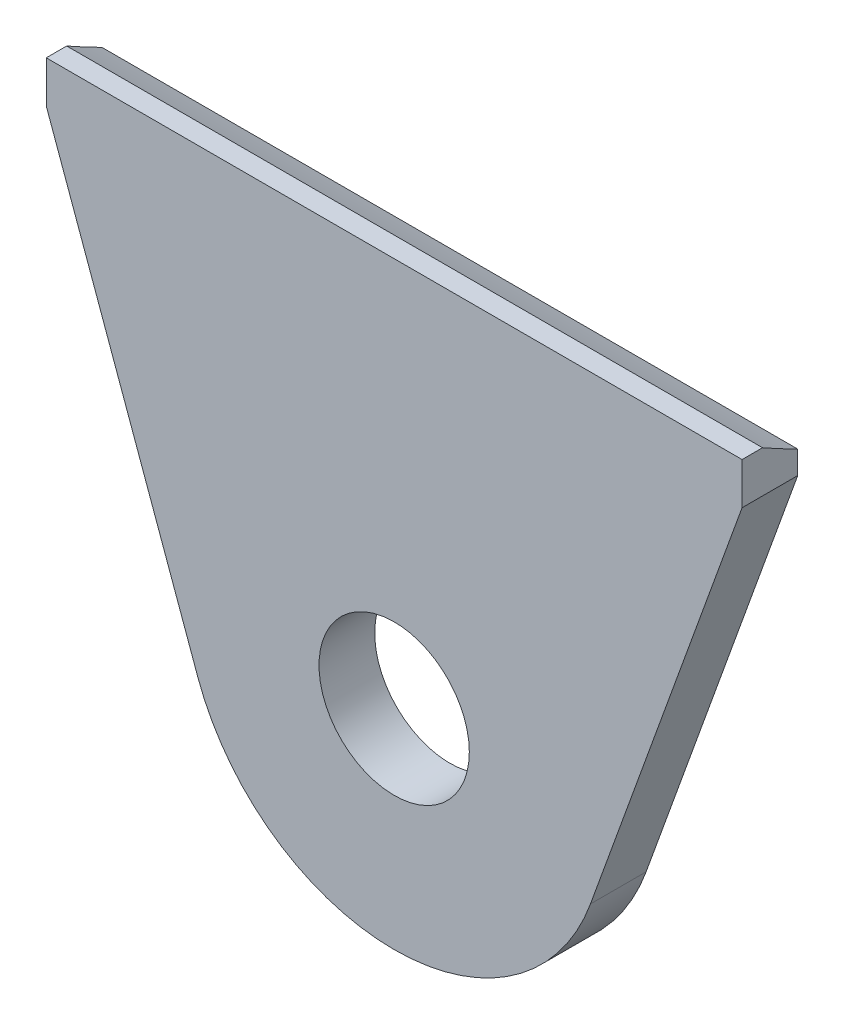
ISO-10303-21;
HEADER;
FILE_DESCRIPTION(('STEP AP214'),'2;1');
FILE_NAME('part.step','',(''),(''),'','','');
FILE_SCHEMA(('AUTOMOTIVE_DESIGN { 1 0 10303 214 1 1 1 1 }'));
ENDSEC;
DATA;
#1=APPLICATION_CONTEXT('core data for automotive mechanical design processes');
#2=APPLICATION_PROTOCOL_DEFINITION('international standard','automotive_design',2000,#1);
#3=PRODUCT_CONTEXT('',#1,'mechanical');
#4=PRODUCT('Part','Part','',(#3));
#5=PRODUCT_RELATED_PRODUCT_CATEGORY('part','',(#4));
#6=PRODUCT_DEFINITION_FORMATION('','',#4);
#7=PRODUCT_DEFINITION_CONTEXT('part definition',#1,'design');
#8=PRODUCT_DEFINITION('design','',#6,#7);
#9=PRODUCT_DEFINITION_SHAPE('','',#8);
#10=(LENGTH_UNIT() NAMED_UNIT(*) SI_UNIT(.MILLI.,.METRE.));
#11=(NAMED_UNIT(*) PLANE_ANGLE_UNIT() SI_UNIT($,.RADIAN.));
#12=(NAMED_UNIT(*) SI_UNIT($,.STERADIAN.) SOLID_ANGLE_UNIT());
#13=UNCERTAINTY_MEASURE_WITH_UNIT(LENGTH_MEASURE(1.E-05),#10,'distance_accuracy_value','');
#14=(GEOMETRIC_REPRESENTATION_CONTEXT(3) GLOBAL_UNCERTAINTY_ASSIGNED_CONTEXT((#13)) GLOBAL_UNIT_ASSIGNED_CONTEXT((#10,
#11,#12)) REPRESENTATION_CONTEXT('',''));
#15=CARTESIAN_POINT('',(0.,0.,0.));
#16=DIRECTION('',(0.,0.,1.));
#17=DIRECTION('',(1.,0.,0.));
#18=AXIS2_PLACEMENT_3D('',#15,#16,#17);
#19=CARTESIAN_POINT('',(25.,28.,4.));
#20=DIRECTION('',(-1.,0.,0.));
#21=DIRECTION('',(0.,0.,1.));
#22=AXIS2_PLACEMENT_3D('',#19,#20,#21);
#23=PLANE('',#22);
#24=CARTESIAN_POINT('',(25.,86.,-30.));
#25=DIRECTION('',(1.,0.,0.));
#26=DIRECTION('',(0.,0.,-1.));
#27=AXIS2_PLACEMENT_3D('',#24,#25,#26);
#28=CIRCLE('',#27,66.5);
#29=CARTESIAN_POINT('',(25.,28.,2.53075467922627));
#30=VERTEX_POINT('',#29);
#31=CARTESIAN_POINT('',(25.,26.6514532612634,0.));
#32=VERTEX_POINT('',#31);
#33=EDGE_CURVE('E121',#30,#32,#28,.T.);
#34=ORIENTED_EDGE('',*,*,#33,.F.);
#35=DIRECTION('',(0.,0.,-1.));
#36=VECTOR('',#35,1.);
#37=CARTESIAN_POINT('',(25.,28.,4.));
#38=LINE('',#37,#36);
#39=CARTESIAN_POINT('',(25.,28.,4.));
#40=VERTEX_POINT('',#39);
#41=EDGE_CURVE('E120',#40,#30,#38,.T.);
#42=ORIENTED_EDGE('',*,*,#41,.F.);
#43=DIRECTION('',(0.,1.,0.));
#44=VECTOR('',#43,1.);
#45=CARTESIAN_POINT('',(25.,28.,4.));
#46=LINE('',#45,#44);
#47=CARTESIAN_POINT('',(25.,25.,4.));
#48=VERTEX_POINT('',#47);
#49=EDGE_CURVE('E105',#48,#40,#46,.T.);
#50=ORIENTED_EDGE('',*,*,#49,.F.);
#51=DIRECTION('',(0.,0.,-1.));
#52=VECTOR('',#51,1.);
#53=CARTESIAN_POINT('',(25.,25.,4.));
#54=LINE('',#53,#52);
#55=CARTESIAN_POINT('',(25.,25.,0.));
#56=VERTEX_POINT('',#55);
#57=EDGE_CURVE('E123',#48,#56,#54,.T.);
#58=ORIENTED_EDGE('',*,*,#57,.T.);
#59=DIRECTION('',(0.,1.,0.));
#60=VECTOR('',#59,1.);
#61=CARTESIAN_POINT('',(25.,28.,0.));
#62=LINE('',#61,#60);
#63=EDGE_CURVE('E141',#56,#32,#62,.T.);
#64=ORIENTED_EDGE('',*,*,#63,.T.);
#65=EDGE_LOOP('',(#34,#42,#50,#58,#64));
#66=FACE_BOUND('',#65,.T.);
#67=ADVANCED_FACE('F41',(#66),#23,.F.);
#68=CARTESIAN_POINT('',(0.,0.,4.));
#69=DIRECTION('',(0.,0.,1.));
#70=DIRECTION('',(1.,0.,0.));
#71=AXIS2_PLACEMENT_3D('',#68,#69,#70);
#72=PLANE('',#71);
#73=DIRECTION('',(0.340312423743285,-0.940312423743285,0.));
#74=VECTOR('',#73,1.);
#75=CARTESIAN_POINT('',(-25.,25.,4.));
#76=LINE('',#75,#74);
#77=CARTESIAN_POINT('',(-25.,25.,4.));
#78=VERTEX_POINT('',#77);
#79=CARTESIAN_POINT('',(-14.1046863561493,-5.10468635614927,4.));
#80=VERTEX_POINT('',#79);
#81=EDGE_CURVE('E143',#78,#80,#76,.T.);
#82=ORIENTED_EDGE('',*,*,#81,.T.);
#83=CARTESIAN_POINT('',(0.,0.,4.));
#84=DIRECTION('',(0.,0.,1.));
#85=DIRECTION('',(1.,0.,0.));
#86=AXIS2_PLACEMENT_3D('',#83,#84,#85);
#87=CIRCLE('',#86,15.);
#88=CARTESIAN_POINT('',(14.1046863561493,-5.10468635614927,4.));
#89=VERTEX_POINT('',#88);
#90=EDGE_CURVE('E92',#80,#89,#87,.T.);
#91=ORIENTED_EDGE('',*,*,#90,.T.);
#92=DIRECTION('',(0.340312423743285,0.940312423743285,0.));
#93=VECTOR('',#92,1.);
#94=CARTESIAN_POINT('',(25.,25.,4.));
#95=LINE('',#94,#93);
#96=EDGE_CURVE('E109',#89,#48,#95,.T.);
#97=ORIENTED_EDGE('',*,*,#96,.T.);
#98=ORIENTED_EDGE('',*,*,#49,.T.);
#99=DIRECTION('',(-1.,0.,0.));
#100=VECTOR('',#99,1.);
#101=CARTESIAN_POINT('',(-25.,28.,4.));
#102=LINE('',#101,#100);
#103=CARTESIAN_POINT('',(-25.,28.,4.));
#104=VERTEX_POINT('',#103);
#105=EDGE_CURVE('E107',#40,#104,#102,.T.);
#106=ORIENTED_EDGE('',*,*,#105,.T.);
#107=DIRECTION('',(0.,-1.,0.));
#108=VECTOR('',#107,1.);
#109=CARTESIAN_POINT('',(-25.,28.,4.));
#110=LINE('',#109,#108);
#111=EDGE_CURVE('E63',#104,#78,#110,.T.);
#112=ORIENTED_EDGE('',*,*,#111,.T.);
#113=EDGE_LOOP('',(#82,#91,#97,#98,#106,#112));
#114=FACE_BOUND('',#113,.T.);
#115=CARTESIAN_POINT('',(0.,0.,4.));
#116=DIRECTION('',(0.,0.,1.));
#117=DIRECTION('',(1.,0.,0.));
#118=AXIS2_PLACEMENT_3D('',#115,#116,#117);
#119=CIRCLE('',#118,5.4);
#120=CARTESIAN_POINT('',(5.4,0.,4.));
#121=VERTEX_POINT('',#120);
#122=EDGE_CURVE('E140',#121,#121,#119,.T.);
#123=ORIENTED_EDGE('',*,*,#122,.F.);
#124=EDGE_LOOP('',(#123));
#125=FACE_BOUND('',#124,.T.);
#126=ADVANCED_FACE('F104',(#114,#125),#72,.T.);
#127=CARTESIAN_POINT('',(0.,0.,0.));
#128=DIRECTION('',(0.,0.,1.));
#129=DIRECTION('',(1.,0.,0.));
#130=AXIS2_PLACEMENT_3D('',#127,#128,#129);
#131=PLANE('',#130);
#132=DIRECTION('',(0.,-1.,0.));
#133=VECTOR('',#132,1.);
#134=CARTESIAN_POINT('',(-25.,28.,0.));
#135=LINE('',#134,#133);
#136=CARTESIAN_POINT('',(-25.,26.6514532612634,0.));
#137=VERTEX_POINT('',#136);
#138=CARTESIAN_POINT('',(-25.,25.,0.));
#139=VERTEX_POINT('',#138);
#140=EDGE_CURVE('E83',#137,#139,#135,.T.);
#141=ORIENTED_EDGE('',*,*,#140,.F.);
#142=DIRECTION('',(1.,0.,0.));
#143=VECTOR('',#142,1.);
#144=CARTESIAN_POINT('',(-25.,26.6514532612634,0.));
#145=LINE('',#144,#143);
#146=EDGE_CURVE('E160',#137,#32,#145,.T.);
#147=ORIENTED_EDGE('',*,*,#146,.T.);
#148=ORIENTED_EDGE('',*,*,#63,.F.);
#149=DIRECTION('',(0.340312423743285,0.940312423743285,0.));
#150=VECTOR('',#149,1.);
#151=CARTESIAN_POINT('',(25.,25.,0.));
#152=LINE('',#151,#150);
#153=CARTESIAN_POINT('',(14.1046863561493,-5.10468635614927,0.));
#154=VERTEX_POINT('',#153);
#155=EDGE_CURVE('E136',#154,#56,#152,.T.);
#156=ORIENTED_EDGE('',*,*,#155,.F.);
#157=CARTESIAN_POINT('',(0.,0.,0.));
#158=DIRECTION('',(0.,0.,1.));
#159=DIRECTION('',(1.,0.,0.));
#160=AXIS2_PLACEMENT_3D('',#157,#158,#159);
#161=CIRCLE('',#160,15.);
#162=CARTESIAN_POINT('',(-14.1046863561493,-5.10468635614927,0.));
#163=VERTEX_POINT('',#162);
#164=EDGE_CURVE('E137',#163,#154,#161,.T.);
#165=ORIENTED_EDGE('',*,*,#164,.F.);
#166=DIRECTION('',(0.340312423743285,-0.940312423743285,0.));
#167=VECTOR('',#166,1.);
#168=CARTESIAN_POINT('',(-25.,25.,0.));
#169=LINE('',#168,#167);
#170=EDGE_CURVE('E134',#139,#163,#169,.T.);
#171=ORIENTED_EDGE('',*,*,#170,.F.);
#172=EDGE_LOOP('',(#141,#147,#148,#156,#165,#171));
#173=FACE_BOUND('',#172,.T.);
#174=CARTESIAN_POINT('',(0.,0.,0.));
#175=DIRECTION('',(0.,0.,1.));
#176=DIRECTION('',(1.,0.,0.));
#177=AXIS2_PLACEMENT_3D('',#174,#175,#176);
#178=CIRCLE('',#177,5.4);
#179=CARTESIAN_POINT('',(5.4,0.,0.));
#180=VERTEX_POINT('',#179);
#181=EDGE_CURVE('E165',#180,#180,#178,.T.);
#182=ORIENTED_EDGE('',*,*,#181,.T.);
#183=EDGE_LOOP('',(#182));
#184=FACE_BOUND('',#183,.T.);
#185=ADVANCED_FACE('F153',(#173,#184),#131,.F.);
#186=CARTESIAN_POINT('',(-25.,25.,4.));
#187=DIRECTION('',(0.940312423743285,0.340312423743285,0.));
#188=DIRECTION('',(-0.340312423743285,0.940312423743285,0.));
#189=AXIS2_PLACEMENT_3D('',#186,#187,#188);
#190=PLANE('',#189);
#191=ORIENTED_EDGE('',*,*,#170,.T.);
#192=DIRECTION('',(0.,0.,-1.));
#193=VECTOR('',#192,1.);
#194=CARTESIAN_POINT('',(-14.1046863561493,-5.10468635614927,4.));
#195=LINE('',#194,#193);
#196=EDGE_CURVE('E11',#80,#163,#195,.T.);
#197=ORIENTED_EDGE('',*,*,#196,.F.);
#198=ORIENTED_EDGE('',*,*,#81,.F.);
#199=DIRECTION('',(0.,0.,-1.));
#200=VECTOR('',#199,1.);
#201=CARTESIAN_POINT('',(-25.,25.,4.));
#202=LINE('',#201,#200);
#203=EDGE_CURVE('E128',#78,#139,#202,.T.);
#204=ORIENTED_EDGE('',*,*,#203,.T.);
#205=EDGE_LOOP('',(#191,#197,#198,#204));
#206=FACE_BOUND('',#205,.T.);
#207=ADVANCED_FACE('F43',(#206),#190,.F.);
#208=CARTESIAN_POINT('',(0.,0.,4.));
#209=DIRECTION('',(0.,0.,-1.));
#210=DIRECTION('',(-1.,0.,0.));
#211=AXIS2_PLACEMENT_3D('',#208,#209,#210);
#212=CYLINDRICAL_SURFACE('',#211,15.);
#213=ORIENTED_EDGE('',*,*,#164,.T.);
#214=DIRECTION('',(0.,0.,-1.));
#215=VECTOR('',#214,1.);
#216=CARTESIAN_POINT('',(14.1046863561493,-5.10468635614927,4.));
#217=LINE('',#216,#215);
#218=EDGE_CURVE('E47',#89,#154,#217,.T.);
#219=ORIENTED_EDGE('',*,*,#218,.F.);
#220=ORIENTED_EDGE('',*,*,#90,.F.);
#221=ORIENTED_EDGE('',*,*,#196,.T.);
#222=EDGE_LOOP('',(#213,#219,#220,#221));
#223=FACE_BOUND('',#222,.T.);
#224=ADVANCED_FACE('F198',(#223),#212,.T.);
#225=CARTESIAN_POINT('',(25.,25.,4.));
#226=DIRECTION('',(-0.940312423743285,0.340312423743285,0.));
#227=DIRECTION('',(-0.340312423743285,-0.940312423743285,0.));
#228=AXIS2_PLACEMENT_3D('',#225,#226,#227);
#229=PLANE('',#228);
#230=ORIENTED_EDGE('',*,*,#155,.T.);
#231=ORIENTED_EDGE('',*,*,#57,.F.);
#232=ORIENTED_EDGE('',*,*,#96,.F.);
#233=ORIENTED_EDGE('',*,*,#218,.T.);
#234=EDGE_LOOP('',(#230,#231,#232,#233));
#235=FACE_BOUND('',#234,.T.);
#236=ADVANCED_FACE('F146',(#235),#229,.F.);
#237=CARTESIAN_POINT('',(-25.,28.,4.));
#238=DIRECTION('',(0.,-1.,0.));
#239=DIRECTION('',(1.,0.,0.));
#240=AXIS2_PLACEMENT_3D('',#237,#238,#239);
#241=PLANE('',#240);
#242=ORIENTED_EDGE('',*,*,#41,.T.);
#243=DIRECTION('',(1.,0.,0.));
#244=VECTOR('',#243,1.);
#245=CARTESIAN_POINT('',(-25.,28.,2.53075467922626));
#246=LINE('',#245,#244);
#247=CARTESIAN_POINT('',(-25.,28.,2.53075467922626));
#248=VERTEX_POINT('',#247);
#249=EDGE_CURVE('E159',#30,#248,#246,.F.);
#250=ORIENTED_EDGE('',*,*,#249,.T.);
#251=DIRECTION('',(0.,0.,-1.));
#252=VECTOR('',#251,1.);
#253=CARTESIAN_POINT('',(-25.,28.,4.));
#254=LINE('',#253,#252);
#255=EDGE_CURVE('E122',#104,#248,#254,.T.);
#256=ORIENTED_EDGE('',*,*,#255,.F.);
#257=ORIENTED_EDGE('',*,*,#105,.F.);
#258=EDGE_LOOP('',(#242,#250,#256,#257));
#259=FACE_BOUND('',#258,.T.);
#260=ADVANCED_FACE('F126',(#259),#241,.F.);
#261=CARTESIAN_POINT('',(-25.,28.,4.));
#262=DIRECTION('',(1.,0.,0.));
#263=DIRECTION('',(0.,0.,-1.));
#264=AXIS2_PLACEMENT_3D('',#261,#262,#263);
#265=PLANE('',#264);
#266=ORIENTED_EDGE('',*,*,#255,.T.);
#267=CARTESIAN_POINT('',(-25.,86.,-30.));
#268=DIRECTION('',(1.,0.,0.));
#269=DIRECTION('',(0.,0.,-1.));
#270=AXIS2_PLACEMENT_3D('',#267,#268,#269);
#271=CIRCLE('',#270,66.5);
#272=EDGE_CURVE('E57',#248,#137,#271,.T.);
#273=ORIENTED_EDGE('',*,*,#272,.T.);
#274=ORIENTED_EDGE('',*,*,#140,.T.);
#275=ORIENTED_EDGE('',*,*,#203,.F.);
#276=ORIENTED_EDGE('',*,*,#111,.F.);
#277=EDGE_LOOP('',(#266,#273,#274,#275,#276));
#278=FACE_BOUND('',#277,.T.);
#279=ADVANCED_FACE('F161',(#278),#265,.F.);
#280=CARTESIAN_POINT('',(0.,0.,4.));
#281=DIRECTION('',(0.,0.,-1.));
#282=DIRECTION('',(-1.,0.,0.));
#283=AXIS2_PLACEMENT_3D('',#280,#281,#282);
#284=CYLINDRICAL_SURFACE('',#283,5.4);
#285=ORIENTED_EDGE('',*,*,#122,.T.);
#286=EDGE_LOOP('',(#285));
#287=FACE_BOUND('',#286,.T.);
#288=ORIENTED_EDGE('',*,*,#181,.F.);
#289=EDGE_LOOP('',(#288));
#290=FACE_BOUND('',#289,.T.);
#291=ADVANCED_FACE('F179',(#287,#290),#284,.F.);
#292=CARTESIAN_POINT('',(-25.,86.,-30.));
#293=DIRECTION('',(1.,0.,0.));
#294=DIRECTION('',(0.,0.,-1.));
#295=AXIS2_PLACEMENT_3D('',#292,#293,#294);
#296=CYLINDRICAL_SURFACE('',#295,66.5);
#297=ORIENTED_EDGE('',*,*,#272,.F.);
#298=ORIENTED_EDGE('',*,*,#249,.F.);
#299=ORIENTED_EDGE('',*,*,#33,.T.);
#300=ORIENTED_EDGE('',*,*,#146,.F.);
#301=EDGE_LOOP('',(#297,#298,#299,#300));
#302=FACE_BOUND('',#301,.T.);
#303=ADVANCED_FACE('F162',(#302),#296,.F.);
#304=CLOSED_SHELL('',(#67,#126,#185,#207,#224,#236,#260,#279,#291,#303));
#305=MANIFOLD_SOLID_BREP('B2',#304);
#306=ADVANCED_BREP_SHAPE_REPRESENTATION('',(#18,#305),#14);
#307=SHAPE_DEFINITION_REPRESENTATION(#9,#306);
ENDSEC;
END-ISO-10303-21;
